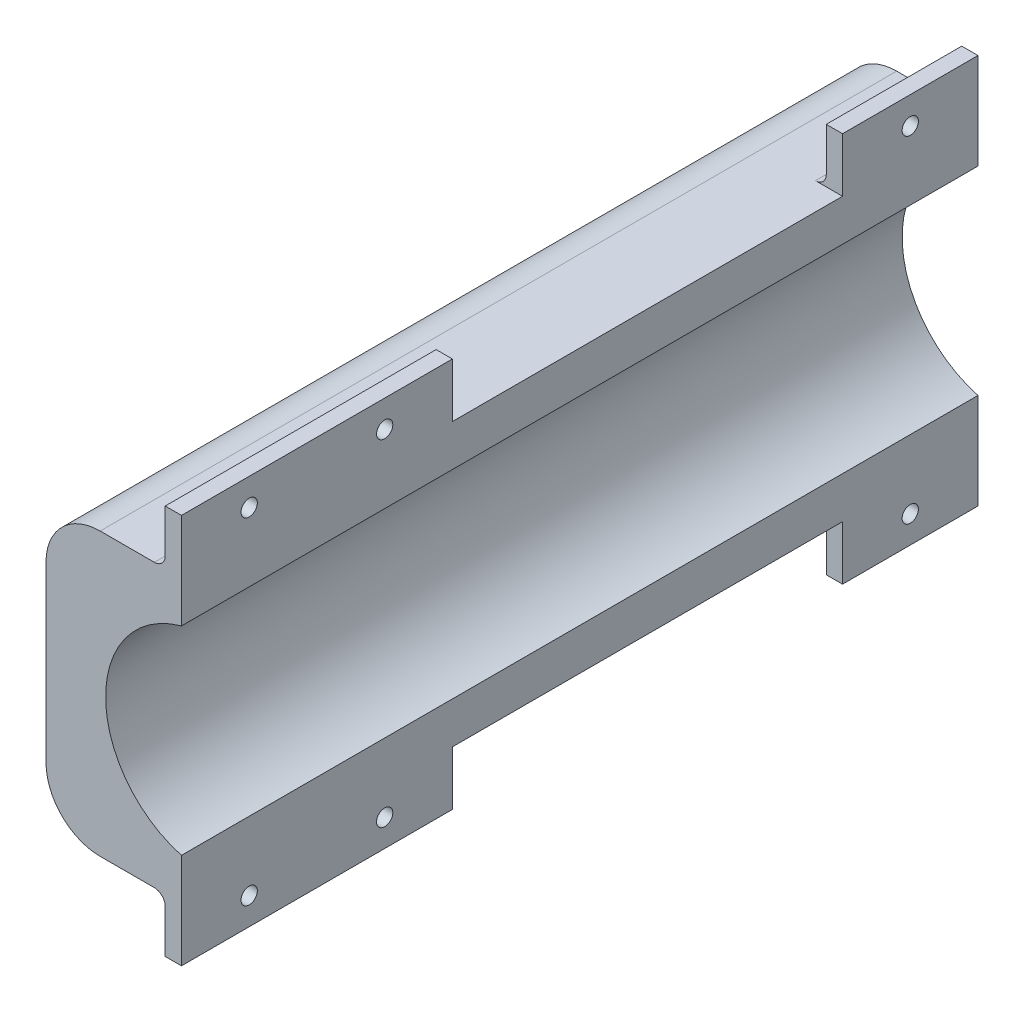
ISO-10303-21;
HEADER;
FILE_DESCRIPTION(('STEP AP214'),'2;1');
FILE_NAME('part.step','',(''),(''),'','','');
FILE_SCHEMA(('AUTOMOTIVE_DESIGN { 1 0 10303 214 1 1 1 1 }'));
ENDSEC;
DATA;
#1=APPLICATION_CONTEXT('core data for automotive mechanical design processes');
#2=APPLICATION_PROTOCOL_DEFINITION('international standard','automotive_design',2000,#1);
#3=PRODUCT_CONTEXT('',#1,'mechanical');
#4=PRODUCT('Part','Part','',(#3));
#5=PRODUCT_RELATED_PRODUCT_CATEGORY('part','',(#4));
#6=PRODUCT_DEFINITION_FORMATION('','',#4);
#7=PRODUCT_DEFINITION_CONTEXT('part definition',#1,'design');
#8=PRODUCT_DEFINITION('design','',#6,#7);
#9=PRODUCT_DEFINITION_SHAPE('','',#8);
#10=(LENGTH_UNIT() NAMED_UNIT(*) SI_UNIT(.MILLI.,.METRE.));
#11=(NAMED_UNIT(*) PLANE_ANGLE_UNIT() SI_UNIT($,.RADIAN.));
#12=(NAMED_UNIT(*) SI_UNIT($,.STERADIAN.) SOLID_ANGLE_UNIT());
#13=UNCERTAINTY_MEASURE_WITH_UNIT(LENGTH_MEASURE(1.E-05),#10,'distance_accuracy_value','');
#14=(GEOMETRIC_REPRESENTATION_CONTEXT(3) GLOBAL_UNCERTAINTY_ASSIGNED_CONTEXT((#13)) GLOBAL_UNIT_ASSIGNED_CONTEXT((#10,
#11,#12)) REPRESENTATION_CONTEXT('',''));
#15=CARTESIAN_POINT('',(0.,0.,0.));
#16=DIRECTION('',(0.,0.,1.));
#17=DIRECTION('',(1.,0.,0.));
#18=AXIS2_PLACEMENT_3D('',#15,#16,#17);
#19=CARTESIAN_POINT('',(-91.4594919412775,15.9586901512976,-147.));
#20=DIRECTION('',(0.,1.,0.));
#21=DIRECTION('',(-1.,0.,0.));
#22=AXIS2_PLACEMENT_3D('',#19,#20,#21);
#23=PLANE('',#22);
#24=DIRECTION('',(1.,0.,0.));
#25=VECTOR('',#24,1.);
#26=CARTESIAN_POINT('',(-94.4594919412775,15.9586901512976,-122.));
#27=LINE('',#26,#25);
#28=CARTESIAN_POINT('',(-96.4594919412775,15.9586901512976,-122.));
#29=VERTEX_POINT('',#28);
#30=CARTESIAN_POINT('',(-91.4594919412775,15.9586901512976,-122.));
#31=VERTEX_POINT('',#30);
#32=EDGE_CURVE('E295',#29,#31,#27,.T.);
#33=ORIENTED_EDGE('',*,*,#32,.F.);
#34=DIRECTION('',(0.,0.,-1.));
#35=VECTOR('',#34,1.);
#36=CARTESIAN_POINT('',(-96.4594919412775,15.9586901512976,-147.));
#37=LINE('',#36,#35);
#38=CARTESIAN_POINT('',(-96.4594919412775,15.9586901512976,-147.));
#39=VERTEX_POINT('',#38);
#40=EDGE_CURVE('E404',#29,#39,#37,.T.);
#41=ORIENTED_EDGE('',*,*,#40,.T.);
#42=DIRECTION('',(-1.,0.,0.));
#43=VECTOR('',#42,1.);
#44=CARTESIAN_POINT('',(-91.4594919412775,15.9586901512976,-147.));
#45=LINE('',#44,#43);
#46=CARTESIAN_POINT('',(-106.459491941278,15.9586901512976,-147.));
#47=VERTEX_POINT('',#46);
#48=EDGE_CURVE('E349',#39,#47,#45,.T.);
#49=ORIENTED_EDGE('',*,*,#48,.T.);
#50=DIRECTION('',(0.,0.,1.));
#51=VECTOR('',#50,1.);
#52=CARTESIAN_POINT('',(-106.459491941278,15.9586901512976,-147.));
#53=LINE('',#52,#51);
#54=CARTESIAN_POINT('',(-106.459491941278,15.9586901512976,0.));
#55=VERTEX_POINT('',#54);
#56=EDGE_CURVE('E368',#47,#55,#53,.T.);
#57=ORIENTED_EDGE('',*,*,#56,.T.);
#58=DIRECTION('',(-1.,0.,0.));
#59=VECTOR('',#58,1.);
#60=CARTESIAN_POINT('',(-91.4594919412775,15.9586901512976,0.));
#61=LINE('',#60,#59);
#62=CARTESIAN_POINT('',(-96.4594919412775,15.9586901512976,0.));
#63=VERTEX_POINT('',#62);
#64=EDGE_CURVE('E340',#63,#55,#61,.T.);
#65=ORIENTED_EDGE('',*,*,#64,.F.);
#66=DIRECTION('',(0.,0.,-1.));
#67=VECTOR('',#66,1.);
#68=CARTESIAN_POINT('',(-96.4594919412775,15.9586901512976,-50.));
#69=LINE('',#68,#67);
#70=CARTESIAN_POINT('',(-96.4594919412775,15.9586901512976,-50.));
#71=VERTEX_POINT('',#70);
#72=EDGE_CURVE('E401',#63,#71,#69,.T.);
#73=ORIENTED_EDGE('',*,*,#72,.T.);
#74=DIRECTION('',(1.,0.,0.));
#75=VECTOR('',#74,1.);
#76=CARTESIAN_POINT('',(-94.4594919412775,15.9586901512976,-50.));
#77=LINE('',#76,#75);
#78=CARTESIAN_POINT('',(-91.4594919412775,15.9586901512976,-50.));
#79=VERTEX_POINT('',#78);
#80=EDGE_CURVE('E323',#71,#79,#77,.T.);
#81=ORIENTED_EDGE('',*,*,#80,.T.);
#82=DIRECTION('',(0.,0.,1.));
#83=VECTOR('',#82,1.);
#84=CARTESIAN_POINT('',(-91.4594919412775,15.9586901512976,-147.));
#85=LINE('',#84,#83);
#86=EDGE_CURVE('E366',#31,#79,#85,.T.);
#87=ORIENTED_EDGE('',*,*,#86,.F.);
#88=EDGE_LOOP('',(#33,#41,#49,#57,#65,#73,#81,#87));
#89=FACE_BOUND('',#88,.T.);
#90=ADVANCED_FACE('F39',(#89),#23,.T.);
#91=CARTESIAN_POINT('',(-116.459491941278,-36.0413098487024,-147.));
#92=DIRECTION('',(-1.,0.,0.));
#93=DIRECTION('',(0.,0.,1.));
#94=AXIS2_PLACEMENT_3D('',#91,#92,#93);
#95=PLANE('',#94);
#96=DIRECTION('',(0.,-1.,0.));
#97=VECTOR('',#96,1.);
#98=CARTESIAN_POINT('',(-116.459491941278,-36.0413098487024,0.));
#99=LINE('',#98,#97);
#100=CARTESIAN_POINT('',(-116.459491941278,5.95869015129755,0.));
#101=VERTEX_POINT('',#100);
#102=CARTESIAN_POINT('',(-116.459491941278,-26.0413098487024,0.));
#103=VERTEX_POINT('',#102);
#104=EDGE_CURVE('E331',#101,#103,#99,.T.);
#105=ORIENTED_EDGE('',*,*,#104,.F.);
#106=DIRECTION('',(0.,0.,1.));
#107=VECTOR('',#106,1.);
#108=CARTESIAN_POINT('',(-116.459491941278,5.95869015129756,-147.));
#109=LINE('',#108,#107);
#110=CARTESIAN_POINT('',(-116.459491941278,5.95869015129755,-147.));
#111=VERTEX_POINT('',#110);
#112=EDGE_CURVE('E383',#101,#111,#109,.F.);
#113=ORIENTED_EDGE('',*,*,#112,.T.);
#114=DIRECTION('',(0.,-1.,0.));
#115=VECTOR('',#114,1.);
#116=CARTESIAN_POINT('',(-116.459491941278,-36.0413098487024,-147.));
#117=LINE('',#116,#115);
#118=CARTESIAN_POINT('',(-116.459491941278,-26.0413098487024,-147.));
#119=VERTEX_POINT('',#118);
#120=EDGE_CURVE('E336',#111,#119,#117,.T.);
#121=ORIENTED_EDGE('',*,*,#120,.T.);
#122=DIRECTION('',(0.,0.,1.));
#123=VECTOR('',#122,1.);
#124=CARTESIAN_POINT('',(-116.459491941278,-26.0413098487024,-147.));
#125=LINE('',#124,#123);
#126=EDGE_CURVE('E380',#119,#103,#125,.T.);
#127=ORIENTED_EDGE('',*,*,#126,.T.);
#128=EDGE_LOOP('',(#105,#113,#121,#127));
#129=FACE_BOUND('',#128,.T.);
#130=ADVANCED_FACE('F492',(#129),#95,.T.);
#131=CARTESIAN_POINT('',(-91.4594919412775,15.9586901512976,-147.));
#132=DIRECTION('',(1.,0.,0.));
#133=DIRECTION('',(0.,0.,-1.));
#134=AXIS2_PLACEMENT_3D('',#131,#132,#133);
#135=PLANE('',#134);
#136=DIRECTION('',(0.,1.,0.));
#137=VECTOR('',#136,1.);
#138=CARTESIAN_POINT('',(-91.4594919412775,15.9586901512976,0.));
#139=LINE('',#138,#137);
#140=CARTESIAN_POINT('',(-91.4594919412775,8.28899293112093,0.));
#141=VERTEX_POINT('',#140);
#142=CARTESIAN_POINT('',(-91.4594919412775,25.9586901512976,0.));
#143=VERTEX_POINT('',#142);
#144=EDGE_CURVE('E363',#141,#143,#139,.T.);
#145=ORIENTED_EDGE('',*,*,#144,.F.);
#146=DIRECTION('',(0.,0.,1.));
#147=VECTOR('',#146,1.);
#148=CARTESIAN_POINT('',(-91.4594919412775,8.28899293112093,-147.));
#149=LINE('',#148,#147);
#150=CARTESIAN_POINT('',(-91.4594919412775,8.28899293112093,-147.));
#151=VERTEX_POINT('',#150);
#152=EDGE_CURVE('E369',#151,#141,#149,.T.);
#153=ORIENTED_EDGE('',*,*,#152,.F.);
#154=DIRECTION('',(0.,1.,0.));
#155=VECTOR('',#154,1.);
#156=CARTESIAN_POINT('',(-91.4594919412775,15.9586901512976,-147.));
#157=LINE('',#156,#155);
#158=CARTESIAN_POINT('',(-91.4594919412775,25.9586901512976,-147.));
#159=VERTEX_POINT('',#158);
#160=EDGE_CURVE('E347',#151,#159,#157,.T.);
#161=ORIENTED_EDGE('',*,*,#160,.T.);
#162=DIRECTION('',(0.,0.,1.));
#163=VECTOR('',#162,1.);
#164=CARTESIAN_POINT('',(-91.4594919412775,25.9586901512976,-122.));
#165=LINE('',#164,#163);
#166=CARTESIAN_POINT('',(-91.4594919412775,25.9586901512976,-122.));
#167=VERTEX_POINT('',#166);
#168=EDGE_CURVE('E278',#159,#167,#165,.T.);
#169=ORIENTED_EDGE('',*,*,#168,.T.);
#170=DIRECTION('',(0.,-1.,0.));
#171=VECTOR('',#170,1.);
#172=CARTESIAN_POINT('',(-91.4594919412775,15.9586901512976,-122.));
#173=LINE('',#172,#171);
#174=EDGE_CURVE('E284',#167,#31,#173,.T.);
#175=ORIENTED_EDGE('',*,*,#174,.T.);
#176=ORIENTED_EDGE('',*,*,#86,.T.);
#177=DIRECTION('',(0.,1.,0.));
#178=VECTOR('',#177,1.);
#179=CARTESIAN_POINT('',(-91.4594919412775,25.9586901512976,-50.));
#180=LINE('',#179,#178);
#181=CARTESIAN_POINT('',(-91.4594919412775,25.9586901512976,-50.));
#182=VERTEX_POINT('',#181);
#183=EDGE_CURVE('E312',#79,#182,#180,.T.);
#184=ORIENTED_EDGE('',*,*,#183,.T.);
#185=DIRECTION('',(0.,0.,1.));
#186=VECTOR('',#185,1.);
#187=CARTESIAN_POINT('',(-91.4594919412775,25.9586901512976,0.));
#188=LINE('',#187,#186);
#189=EDGE_CURVE('E318',#182,#143,#188,.T.);
#190=ORIENTED_EDGE('',*,*,#189,.T.);
#191=EDGE_LOOP('',(#145,#153,#161,#169,#175,#176,#184,#190));
#192=FACE_BOUND('',#191,.T.);
#193=CARTESIAN_POINT('',(-91.4594919412775,20.9586901512976,-37.5));
#194=DIRECTION('',(1.,0.,0.));
#195=DIRECTION('',(0.,0.,1.));
#196=AXIS2_PLACEMENT_3D('',#193,#194,#195);
#197=CIRCLE('',#196,1.5);
#198=CARTESIAN_POINT('',(-91.4594919412775,20.9586901512976,-36.));
#199=VERTEX_POINT('',#198);
#200=EDGE_CURVE('E298',#199,#199,#197,.T.);
#201=ORIENTED_EDGE('',*,*,#200,.F.);
#202=EDGE_LOOP('',(#201));
#203=FACE_BOUND('',#202,.T.);
#204=CARTESIAN_POINT('',(-91.4594919412775,20.9586901512976,-12.5));
#205=DIRECTION('',(1.,0.,0.));
#206=DIRECTION('',(0.,0.,-1.));
#207=AXIS2_PLACEMENT_3D('',#204,#205,#206);
#208=CIRCLE('',#207,1.5);
#209=CARTESIAN_POINT('',(-91.4594919412775,20.9586901512976,-14.));
#210=VERTEX_POINT('',#209);
#211=EDGE_CURVE('E306',#210,#210,#208,.T.);
#212=ORIENTED_EDGE('',*,*,#211,.F.);
#213=EDGE_LOOP('',(#212));
#214=FACE_BOUND('',#213,.T.);
#215=CARTESIAN_POINT('',(-91.4594919412775,20.9586901512976,-134.5));
#216=DIRECTION('',(1.,0.,0.));
#217=DIRECTION('',(0.,0.,-1.));
#218=AXIS2_PLACEMENT_3D('',#215,#216,#217);
#219=CIRCLE('',#218,1.5);
#220=CARTESIAN_POINT('',(-91.4594919412775,20.9586901512976,-136.));
#221=VERTEX_POINT('',#220);
#222=EDGE_CURVE('E270',#221,#221,#219,.T.);
#223=ORIENTED_EDGE('',*,*,#222,.F.);
#224=EDGE_LOOP('',(#223));
#225=FACE_BOUND('',#224,.T.);
#226=ADVANCED_FACE('F457',(#192,#203,#214,#225),#135,.T.);
#227=CARTESIAN_POINT('',(-86.4594919412775,-10.0413098487024,-147.));
#228=DIRECTION('',(0.,0.,1.));
#229=DIRECTION('',(1.,0.,0.));
#230=AXIS2_PLACEMENT_3D('',#227,#228,#229);
#231=CYLINDRICAL_SURFACE('',#230,19.);
#232=CARTESIAN_POINT('',(-86.4594919412775,-10.0413098487024,0.));
#233=DIRECTION('',(0.,0.,-1.));
#234=DIRECTION('',(1.,0.,0.));
#235=AXIS2_PLACEMENT_3D('',#232,#233,#234);
#236=CIRCLE('',#235,19.);
#237=CARTESIAN_POINT('',(-91.4594919412775,-28.3716126285258,0.));
#238=VERTEX_POINT('',#237);
#239=EDGE_CURVE('E360',#238,#141,#236,.T.);
#240=ORIENTED_EDGE('',*,*,#239,.F.);
#241=DIRECTION('',(0.,0.,1.));
#242=VECTOR('',#241,1.);
#243=CARTESIAN_POINT('',(-91.4594919412775,-28.3716126285258,-147.));
#244=LINE('',#243,#242);
#245=CARTESIAN_POINT('',(-91.4594919412775,-28.3716126285258,-147.));
#246=VERTEX_POINT('',#245);
#247=EDGE_CURVE('E371',#246,#238,#244,.T.);
#248=ORIENTED_EDGE('',*,*,#247,.F.);
#249=CARTESIAN_POINT('',(-86.4594919412775,-10.0413098487024,-147.));
#250=DIRECTION('',(0.,0.,-1.));
#251=DIRECTION('',(1.,0.,0.));
#252=AXIS2_PLACEMENT_3D('',#249,#250,#251);
#253=CIRCLE('',#252,19.);
#254=EDGE_CURVE('E344',#246,#151,#253,.T.);
#255=ORIENTED_EDGE('',*,*,#254,.T.);
#256=ORIENTED_EDGE('',*,*,#152,.T.);
#257=EDGE_LOOP('',(#240,#248,#255,#256));
#258=FACE_BOUND('',#257,.T.);
#259=ADVANCED_FACE('F469',(#258),#231,.F.);
#260=CARTESIAN_POINT('',(-91.4594919412775,-28.3716126285258,-147.));
#261=DIRECTION('',(1.,0.,0.));
#262=DIRECTION('',(0.,0.,-1.));
#263=AXIS2_PLACEMENT_3D('',#260,#261,#262);
#264=PLANE('',#263);
#265=DIRECTION('',(0.,1.,0.));
#266=VECTOR('',#265,1.);
#267=CARTESIAN_POINT('',(-91.4594919412775,-28.3716126285258,0.));
#268=LINE('',#267,#266);
#269=CARTESIAN_POINT('',(-91.4594919412775,-46.0413098487024,0.));
#270=VERTEX_POINT('',#269);
#271=EDGE_CURVE('E357',#270,#238,#268,.T.);
#272=ORIENTED_EDGE('',*,*,#271,.F.);
#273=DIRECTION('',(0.,0.,-1.));
#274=VECTOR('',#273,1.);
#275=CARTESIAN_POINT('',(-91.4594919412775,-46.0413098487024,0.));
#276=LINE('',#275,#274);
#277=CARTESIAN_POINT('',(-91.4594919412775,-46.0413098487024,-50.));
#278=VERTEX_POINT('',#277);
#279=EDGE_CURVE('E250',#270,#278,#276,.T.);
#280=ORIENTED_EDGE('',*,*,#279,.T.);
#281=DIRECTION('',(0.,1.,0.));
#282=VECTOR('',#281,1.);
#283=CARTESIAN_POINT('',(-91.4594919412775,-46.0413098487024,-50.));
#284=LINE('',#283,#282);
#285=CARTESIAN_POINT('',(-91.4594919412775,-36.0413098487024,-50.));
#286=VERTEX_POINT('',#285);
#287=EDGE_CURVE('E256',#278,#286,#284,.T.);
#288=ORIENTED_EDGE('',*,*,#287,.T.);
#289=DIRECTION('',(0.,0.,1.));
#290=VECTOR('',#289,1.);
#291=CARTESIAN_POINT('',(-91.4594919412775,-36.0413098487024,-147.));
#292=LINE('',#291,#290);
#293=CARTESIAN_POINT('',(-91.4594919412775,-36.0413098487024,-122.));
#294=VERTEX_POINT('',#293);
#295=EDGE_CURVE('E351',#294,#286,#292,.T.);
#296=ORIENTED_EDGE('',*,*,#295,.F.);
#297=DIRECTION('',(0.,-1.,0.));
#298=VECTOR('',#297,1.);
#299=CARTESIAN_POINT('',(-91.4594919412775,-36.0413098487024,-122.));
#300=LINE('',#299,#298);
#301=CARTESIAN_POINT('',(-91.4594919412775,-46.0413098487024,-122.));
#302=VERTEX_POINT('',#301);
#303=EDGE_CURVE('E226',#294,#302,#300,.T.);
#304=ORIENTED_EDGE('',*,*,#303,.T.);
#305=DIRECTION('',(0.,0.,-1.));
#306=VECTOR('',#305,1.);
#307=CARTESIAN_POINT('',(-91.4594919412775,-46.0413098487024,-122.));
#308=LINE('',#307,#306);
#309=CARTESIAN_POINT('',(-91.4594919412775,-46.0413098487024,-147.));
#310=VERTEX_POINT('',#309);
#311=EDGE_CURVE('E229',#302,#310,#308,.T.);
#312=ORIENTED_EDGE('',*,*,#311,.T.);
#313=DIRECTION('',(0.,1.,0.));
#314=VECTOR('',#313,1.);
#315=CARTESIAN_POINT('',(-91.4594919412775,-28.3716126285258,-147.));
#316=LINE('',#315,#314);
#317=EDGE_CURVE('E207',#310,#246,#316,.T.);
#318=ORIENTED_EDGE('',*,*,#317,.T.);
#319=ORIENTED_EDGE('',*,*,#247,.T.);
#320=EDGE_LOOP('',(#272,#280,#288,#296,#304,#312,#318,#319));
#321=FACE_BOUND('',#320,.T.);
#322=CARTESIAN_POINT('',(-91.4594919412775,-41.0413098487024,-12.5));
#323=DIRECTION('',(1.,0.,0.));
#324=DIRECTION('',(0.,0.,1.));
#325=AXIS2_PLACEMENT_3D('',#322,#323,#324);
#326=CIRCLE('',#325,1.5);
#327=CARTESIAN_POINT('',(-91.4594919412775,-41.0413098487024,-11.));
#328=VERTEX_POINT('',#327);
#329=EDGE_CURVE('E239',#328,#328,#326,.T.);
#330=ORIENTED_EDGE('',*,*,#329,.F.);
#331=EDGE_LOOP('',(#330));
#332=FACE_BOUND('',#331,.T.);
#333=CARTESIAN_POINT('',(-91.4594919412775,-41.0413098487024,-37.5));
#334=DIRECTION('',(1.,0.,0.));
#335=DIRECTION('',(0.,0.,-1.));
#336=AXIS2_PLACEMENT_3D('',#333,#334,#335);
#337=CIRCLE('',#336,1.5);
#338=CARTESIAN_POINT('',(-91.4594919412775,-41.0413098487024,-39.));
#339=VERTEX_POINT('',#338);
#340=EDGE_CURVE('E244',#339,#339,#337,.T.);
#341=ORIENTED_EDGE('',*,*,#340,.F.);
#342=EDGE_LOOP('',(#341));
#343=FACE_BOUND('',#342,.T.);
#344=CARTESIAN_POINT('',(-91.4594919412775,-41.0413098487024,-134.5));
#345=DIRECTION('',(1.,0.,0.));
#346=DIRECTION('',(0.,0.,1.));
#347=AXIS2_PLACEMENT_3D('',#344,#345,#346);
#348=CIRCLE('',#347,1.5);
#349=CARTESIAN_POINT('',(-91.4594919412775,-41.0413098487024,-133.));
#350=VERTEX_POINT('',#349);
#351=EDGE_CURVE('E232',#350,#350,#348,.T.);
#352=ORIENTED_EDGE('',*,*,#351,.F.);
#353=EDGE_LOOP('',(#352));
#354=FACE_BOUND('',#353,.T.);
#355=ADVANCED_FACE('F471',(#321,#332,#343,#354),#264,.T.);
#356=CARTESIAN_POINT('',(-91.4594919412775,-36.0413098487024,-147.));
#357=DIRECTION('',(0.,-1.,0.));
#358=DIRECTION('',(0.,0.,-1.));
#359=AXIS2_PLACEMENT_3D('',#356,#357,#358);
#360=PLANE('',#359);
#361=DIRECTION('',(1.,0.,0.));
#362=VECTOR('',#361,1.);
#363=CARTESIAN_POINT('',(-94.4594919412775,-36.0413098487024,-50.));
#364=LINE('',#363,#362);
#365=CARTESIAN_POINT('',(-96.4594919412775,-36.0413098487024,-50.));
#366=VERTEX_POINT('',#365);
#367=EDGE_CURVE('E267',#366,#286,#364,.T.);
#368=ORIENTED_EDGE('',*,*,#367,.F.);
#369=DIRECTION('',(0.,0.,1.));
#370=VECTOR('',#369,1.);
#371=CARTESIAN_POINT('',(-96.4594919412775,-36.0413098487024,-147.));
#372=LINE('',#371,#370);
#373=CARTESIAN_POINT('',(-96.4594919412775,-36.0413098487024,0.));
#374=VERTEX_POINT('',#373);
#375=EDGE_CURVE('E395',#366,#374,#372,.T.);
#376=ORIENTED_EDGE('',*,*,#375,.T.);
#377=DIRECTION('',(1.,0.,0.));
#378=VECTOR('',#377,1.);
#379=CARTESIAN_POINT('',(-91.4594919412775,-36.0413098487024,0.));
#380=LINE('',#379,#378);
#381=CARTESIAN_POINT('',(-106.459491941278,-36.0413098487024,0.));
#382=VERTEX_POINT('',#381);
#383=EDGE_CURVE('E354',#382,#374,#380,.T.);
#384=ORIENTED_EDGE('',*,*,#383,.F.);
#385=DIRECTION('',(0.,0.,1.));
#386=VECTOR('',#385,1.);
#387=CARTESIAN_POINT('',(-106.459491941278,-36.0413098487024,-147.));
#388=LINE('',#387,#386);
#389=CARTESIAN_POINT('',(-106.459491941278,-36.0413098487024,-147.));
#390=VERTEX_POINT('',#389);
#391=EDGE_CURVE('E390',#382,#390,#388,.F.);
#392=ORIENTED_EDGE('',*,*,#391,.T.);
#393=DIRECTION('',(1.,0.,0.));
#394=VECTOR('',#393,1.);
#395=CARTESIAN_POINT('',(-91.4594919412775,-36.0413098487024,-147.));
#396=LINE('',#395,#394);
#397=CARTESIAN_POINT('',(-96.4594919412775,-36.0413098487024,-147.));
#398=VERTEX_POINT('',#397);
#399=EDGE_CURVE('E339',#390,#398,#396,.T.);
#400=ORIENTED_EDGE('',*,*,#399,.T.);
#401=DIRECTION('',(0.,0.,1.));
#402=VECTOR('',#401,1.);
#403=CARTESIAN_POINT('',(-96.4594919412775,-36.0413098487024,-147.));
#404=LINE('',#403,#402);
#405=CARTESIAN_POINT('',(-96.4594919412775,-36.0413098487024,-122.));
#406=VERTEX_POINT('',#405);
#407=EDGE_CURVE('E392',#398,#406,#404,.T.);
#408=ORIENTED_EDGE('',*,*,#407,.T.);
#409=DIRECTION('',(1.,0.,0.));
#410=VECTOR('',#409,1.);
#411=CARTESIAN_POINT('',(-94.4594919412775,-36.0413098487024,-122.));
#412=LINE('',#411,#410);
#413=EDGE_CURVE('E212',#406,#294,#412,.T.);
#414=ORIENTED_EDGE('',*,*,#413,.T.);
#415=ORIENTED_EDGE('',*,*,#295,.T.);
#416=EDGE_LOOP('',(#368,#376,#384,#392,#400,#408,#414,#415));
#417=FACE_BOUND('',#416,.T.);
#418=ADVANCED_FACE('F484',(#417),#360,.T.);
#419=CARTESIAN_POINT('',(-86.4594919412775,-10.0413098487024,-147.));
#420=DIRECTION('',(0.,0.,1.));
#421=DIRECTION('',(1.,0.,0.));
#422=AXIS2_PLACEMENT_3D('',#419,#420,#421);
#423=PLANE('',#422);
#424=ORIENTED_EDGE('',*,*,#120,.F.);
#425=CARTESIAN_POINT('',(-106.459491941278,5.95869015129756,-147.));
#426=DIRECTION('',(0.,0.,1.));
#427=DIRECTION('',(1.,0.,0.));
#428=AXIS2_PLACEMENT_3D('',#425,#426,#427);
#429=CIRCLE('',#428,10.);
#430=EDGE_CURVE('E387',#111,#47,#429,.F.);
#431=ORIENTED_EDGE('',*,*,#430,.T.);
#432=ORIENTED_EDGE('',*,*,#48,.F.);
#433=CARTESIAN_POINT('',(-96.4594919412775,17.9586901512976,-147.));
#434=DIRECTION('',(0.,0.,1.));
#435=DIRECTION('',(1.,0.,0.));
#436=AXIS2_PLACEMENT_3D('',#433,#434,#435);
#437=CIRCLE('',#436,2.);
#438=CARTESIAN_POINT('',(-94.4594919412775,17.9586901512976,-147.));
#439=VERTEX_POINT('',#438);
#440=EDGE_CURVE('E419',#39,#439,#437,.T.);
#441=ORIENTED_EDGE('',*,*,#440,.T.);
#442=DIRECTION('',(0.,1.,0.));
#443=VECTOR('',#442,1.);
#444=CARTESIAN_POINT('',(-94.4594919412775,25.9586901512976,-147.));
#445=LINE('',#444,#443);
#446=CARTESIAN_POINT('',(-94.4594919412775,25.9586901512976,-147.));
#447=VERTEX_POINT('',#446);
#448=EDGE_CURVE('E281',#439,#447,#445,.T.);
#449=ORIENTED_EDGE('',*,*,#448,.T.);
#450=DIRECTION('',(1.,0.,0.));
#451=VECTOR('',#450,1.);
#452=CARTESIAN_POINT('',(-94.4594919412775,25.9586901512976,-147.));
#453=LINE('',#452,#451);
#454=EDGE_CURVE('E290',#447,#159,#453,.T.);
#455=ORIENTED_EDGE('',*,*,#454,.T.);
#456=ORIENTED_EDGE('',*,*,#160,.F.);
#457=ORIENTED_EDGE('',*,*,#254,.F.);
#458=ORIENTED_EDGE('',*,*,#317,.F.);
#459=DIRECTION('',(1.,0.,0.));
#460=VECTOR('',#459,1.);
#461=CARTESIAN_POINT('',(-94.4594919412775,-46.0413098487024,-147.));
#462=LINE('',#461,#460);
#463=CARTESIAN_POINT('',(-94.4594919412775,-46.0413098487024,-147.));
#464=VERTEX_POINT('',#463);
#465=EDGE_CURVE('E199',#464,#310,#462,.T.);
#466=ORIENTED_EDGE('',*,*,#465,.F.);
#467=DIRECTION('',(0.,1.,0.));
#468=VECTOR('',#467,1.);
#469=CARTESIAN_POINT('',(-94.4594919412775,-46.0413098487024,-147.));
#470=LINE('',#469,#468);
#471=CARTESIAN_POINT('',(-94.4594919412775,-38.0413098487024,-147.));
#472=VERTEX_POINT('',#471);
#473=EDGE_CURVE('E203',#464,#472,#470,.T.);
#474=ORIENTED_EDGE('',*,*,#473,.T.);
#475=CARTESIAN_POINT('',(-96.4594919412775,-38.0413098487024,-147.));
#476=DIRECTION('',(0.,0.,1.));
#477=DIRECTION('',(1.,0.,0.));
#478=AXIS2_PLACEMENT_3D('',#475,#476,#477);
#479=CIRCLE('',#478,2.);
#480=EDGE_CURVE('E417',#472,#398,#479,.T.);
#481=ORIENTED_EDGE('',*,*,#480,.T.);
#482=ORIENTED_EDGE('',*,*,#399,.F.);
#483=CARTESIAN_POINT('',(-106.459491941278,-26.0413098487024,-147.));
#484=DIRECTION('',(0.,0.,1.));
#485=DIRECTION('',(1.,0.,0.));
#486=AXIS2_PLACEMENT_3D('',#483,#484,#485);
#487=CIRCLE('',#486,10.);
#488=EDGE_CURVE('E385',#390,#119,#487,.F.);
#489=ORIENTED_EDGE('',*,*,#488,.T.);
#490=EDGE_LOOP('',(#424,#431,#432,#441,#449,#455,#456,#457,#458,#466,#474,#481,#482,#489));
#491=FACE_BOUND('',#490,.T.);
#492=ADVANCED_FACE('F202',(#491),#423,.F.);
#493=CARTESIAN_POINT('',(-86.4594919412775,-10.0413098487024,0.));
#494=DIRECTION('',(0.,0.,1.));
#495=DIRECTION('',(1.,0.,0.));
#496=AXIS2_PLACEMENT_3D('',#493,#494,#495);
#497=PLANE('',#496);
#498=DIRECTION('',(0.,-1.,0.));
#499=VECTOR('',#498,1.);
#500=CARTESIAN_POINT('',(-94.4594919412775,15.9586901512976,0.));
#501=LINE('',#500,#499);
#502=CARTESIAN_POINT('',(-94.4594919412775,25.9586901512976,0.));
#503=VERTEX_POINT('',#502);
#504=CARTESIAN_POINT('',(-94.4594919412775,17.9586901512976,0.));
#505=VERTEX_POINT('',#504);
#506=EDGE_CURVE('E315',#503,#505,#501,.T.);
#507=ORIENTED_EDGE('',*,*,#506,.T.);
#508=CARTESIAN_POINT('',(-96.4594919412775,17.9586901512976,0.));
#509=DIRECTION('',(0.,0.,1.));
#510=DIRECTION('',(1.,0.,0.));
#511=AXIS2_PLACEMENT_3D('',#508,#509,#510);
#512=CIRCLE('',#511,2.);
#513=EDGE_CURVE('E11',#505,#63,#512,.F.);
#514=ORIENTED_EDGE('',*,*,#513,.T.);
#515=ORIENTED_EDGE('',*,*,#64,.T.);
#516=CARTESIAN_POINT('',(-106.459491941278,5.95869015129756,0.));
#517=DIRECTION('',(0.,0.,1.));
#518=DIRECTION('',(1.,0.,0.));
#519=AXIS2_PLACEMENT_3D('',#516,#517,#518);
#520=CIRCLE('',#519,10.);
#521=EDGE_CURVE('E378',#55,#101,#520,.T.);
#522=ORIENTED_EDGE('',*,*,#521,.T.);
#523=ORIENTED_EDGE('',*,*,#104,.T.);
#524=CARTESIAN_POINT('',(-106.459491941278,-26.0413098487024,0.));
#525=DIRECTION('',(0.,0.,1.));
#526=DIRECTION('',(1.,0.,0.));
#527=AXIS2_PLACEMENT_3D('',#524,#525,#526);
#528=CIRCLE('',#527,10.);
#529=EDGE_CURVE('E376',#103,#382,#528,.T.);
#530=ORIENTED_EDGE('',*,*,#529,.T.);
#531=ORIENTED_EDGE('',*,*,#383,.T.);
#532=CARTESIAN_POINT('',(-96.4594919412775,-38.0413098487024,0.));
#533=DIRECTION('',(0.,0.,1.));
#534=DIRECTION('',(1.,0.,0.));
#535=AXIS2_PLACEMENT_3D('',#532,#533,#534);
#536=CIRCLE('',#535,2.);
#537=CARTESIAN_POINT('',(-94.4594919412775,-38.0413098487024,0.));
#538=VERTEX_POINT('',#537);
#539=EDGE_CURVE('E410',#374,#538,#536,.F.);
#540=ORIENTED_EDGE('',*,*,#539,.T.);
#541=DIRECTION('',(0.,-1.,0.));
#542=VECTOR('',#541,1.);
#543=CARTESIAN_POINT('',(-94.4594919412775,-36.0413098487024,0.));
#544=LINE('',#543,#542);
#545=CARTESIAN_POINT('',(-94.4594919412775,-46.0413098487024,0.));
#546=VERTEX_POINT('',#545);
#547=EDGE_CURVE('E253',#538,#546,#544,.T.);
#548=ORIENTED_EDGE('',*,*,#547,.T.);
#549=DIRECTION('',(1.,0.,0.));
#550=VECTOR('',#549,1.);
#551=CARTESIAN_POINT('',(-94.4594919412775,-46.0413098487024,0.));
#552=LINE('',#551,#550);
#553=EDGE_CURVE('E262',#546,#270,#552,.T.);
#554=ORIENTED_EDGE('',*,*,#553,.T.);
#555=ORIENTED_EDGE('',*,*,#271,.T.);
#556=ORIENTED_EDGE('',*,*,#239,.T.);
#557=ORIENTED_EDGE('',*,*,#144,.T.);
#558=DIRECTION('',(1.,0.,0.));
#559=VECTOR('',#558,1.);
#560=CARTESIAN_POINT('',(-94.4594919412775,25.9586901512976,0.));
#561=LINE('',#560,#559);
#562=EDGE_CURVE('E328',#503,#143,#561,.T.);
#563=ORIENTED_EDGE('',*,*,#562,.F.);
#564=EDGE_LOOP('',(#507,#514,#515,#522,#523,#530,#531,#540,#548,#554,#555,#556,#557,#563));
#565=FACE_BOUND('',#564,.T.);
#566=ADVANCED_FACE('F446',(#565),#497,.T.);
#567=CARTESIAN_POINT('',(-94.4594919412775,25.9586901512976,0.));
#568=DIRECTION('',(0.,1.,0.));
#569=DIRECTION('',(0.,0.,1.));
#570=AXIS2_PLACEMENT_3D('',#567,#568,#569);
#571=PLANE('',#570);
#572=ORIENTED_EDGE('',*,*,#189,.F.);
#573=DIRECTION('',(1.,0.,0.));
#574=VECTOR('',#573,1.);
#575=CARTESIAN_POINT('',(-94.4594919412775,25.9586901512976,-50.));
#576=LINE('',#575,#574);
#577=CARTESIAN_POINT('',(-94.4594919412775,25.9586901512976,-50.));
#578=VERTEX_POINT('',#577);
#579=EDGE_CURVE('E332',#578,#182,#576,.T.);
#580=ORIENTED_EDGE('',*,*,#579,.F.);
#581=DIRECTION('',(0.,0.,1.));
#582=VECTOR('',#581,1.);
#583=CARTESIAN_POINT('',(-94.4594919412775,25.9586901512976,0.));
#584=LINE('',#583,#582);
#585=EDGE_CURVE('E320',#578,#503,#584,.T.);
#586=ORIENTED_EDGE('',*,*,#585,.T.);
#587=ORIENTED_EDGE('',*,*,#562,.T.);
#588=EDGE_LOOP('',(#572,#580,#586,#587));
#589=FACE_BOUND('',#588,.T.);
#590=ADVANCED_FACE('F452',(#589),#571,.T.);
#591=CARTESIAN_POINT('',(-94.4594919412775,25.9586901512976,-50.));
#592=DIRECTION('',(0.,0.,-1.));
#593=DIRECTION('',(-1.,0.,0.));
#594=AXIS2_PLACEMENT_3D('',#591,#592,#593);
#595=PLANE('',#594);
#596=ORIENTED_EDGE('',*,*,#183,.F.);
#597=ORIENTED_EDGE('',*,*,#80,.F.);
#598=CARTESIAN_POINT('',(-96.4594919412775,17.9586901512976,-50.));
#599=DIRECTION('',(0.,0.,-1.));
#600=DIRECTION('',(-1.,0.,0.));
#601=AXIS2_PLACEMENT_3D('',#598,#599,#600);
#602=CIRCLE('',#601,2.);
#603=CARTESIAN_POINT('',(-94.4594919412775,17.9586901512976,-50.));
#604=VERTEX_POINT('',#603);
#605=EDGE_CURVE('E47',#71,#604,#602,.F.);
#606=ORIENTED_EDGE('',*,*,#605,.T.);
#607=DIRECTION('',(0.,1.,0.));
#608=VECTOR('',#607,1.);
#609=CARTESIAN_POINT('',(-94.4594919412775,25.9586901512976,-50.));
#610=LINE('',#609,#608);
#611=EDGE_CURVE('E317',#604,#578,#610,.T.);
#612=ORIENTED_EDGE('',*,*,#611,.T.);
#613=ORIENTED_EDGE('',*,*,#579,.T.);
#614=EDGE_LOOP('',(#596,#597,#606,#612,#613));
#615=FACE_BOUND('',#614,.T.);
#616=ADVANCED_FACE('F454',(#615),#595,.T.);
#617=CARTESIAN_POINT('',(-94.4594919412775,0.,0.));
#618=DIRECTION('',(-1.,0.,0.));
#619=DIRECTION('',(0.,0.,1.));
#620=AXIS2_PLACEMENT_3D('',#617,#618,#619);
#621=PLANE('',#620);
#622=CARTESIAN_POINT('',(-94.4594919412775,20.9586901512976,-37.5));
#623=DIRECTION('',(1.,0.,0.));
#624=DIRECTION('',(0.,0.,1.));
#625=AXIS2_PLACEMENT_3D('',#622,#623,#624);
#626=CIRCLE('',#625,1.5);
#627=CARTESIAN_POINT('',(-94.4594919412775,20.9586901512976,-36.));
#628=VERTEX_POINT('',#627);
#629=EDGE_CURVE('E303',#628,#628,#626,.T.);
#630=ORIENTED_EDGE('',*,*,#629,.T.);
#631=EDGE_LOOP('',(#630));
#632=FACE_BOUND('',#631,.T.);
#633=CARTESIAN_POINT('',(-94.4594919412775,20.9586901512976,-12.5));
#634=DIRECTION('',(1.,0.,0.));
#635=DIRECTION('',(0.,0.,-1.));
#636=AXIS2_PLACEMENT_3D('',#633,#634,#635);
#637=CIRCLE('',#636,1.5);
#638=CARTESIAN_POINT('',(-94.4594919412775,20.9586901512976,-14.));
#639=VERTEX_POINT('',#638);
#640=EDGE_CURVE('E309',#639,#639,#637,.T.);
#641=ORIENTED_EDGE('',*,*,#640,.T.);
#642=EDGE_LOOP('',(#641));
#643=FACE_BOUND('',#642,.T.);
#644=ORIENTED_EDGE('',*,*,#611,.F.);
#645=DIRECTION('',(0.,0.,-1.));
#646=VECTOR('',#645,1.);
#647=CARTESIAN_POINT('',(-94.4594919412775,17.9586901512976,0.));
#648=LINE('',#647,#646);
#649=EDGE_CURVE('E60',#604,#505,#648,.F.);
#650=ORIENTED_EDGE('',*,*,#649,.T.);
#651=ORIENTED_EDGE('',*,*,#506,.F.);
#652=ORIENTED_EDGE('',*,*,#585,.F.);
#653=EDGE_LOOP('',(#644,#650,#651,#652));
#654=FACE_BOUND('',#653,.T.);
#655=ADVANCED_FACE('F448',(#632,#643,#654),#621,.T.);
#656=CARTESIAN_POINT('',(-94.4594919412775,20.9586901512976,-12.5));
#657=DIRECTION('',(1.,0.,0.));
#658=DIRECTION('',(0.,0.,-1.));
#659=AXIS2_PLACEMENT_3D('',#656,#657,#658);
#660=CYLINDRICAL_SURFACE('',#659,1.5);
#661=ORIENTED_EDGE('',*,*,#640,.F.);
#662=EDGE_LOOP('',(#661));
#663=FACE_BOUND('',#662,.T.);
#664=ORIENTED_EDGE('',*,*,#211,.T.);
#665=EDGE_LOOP('',(#664));
#666=FACE_BOUND('',#665,.T.);
#667=ADVANCED_FACE('F639',(#663,#666),#660,.F.);
#668=CARTESIAN_POINT('',(-94.4594919412775,20.9586901512976,-37.5));
#669=DIRECTION('',(1.,0.,0.));
#670=DIRECTION('',(0.,0.,-1.));
#671=AXIS2_PLACEMENT_3D('',#668,#669,#670);
#672=CYLINDRICAL_SURFACE('',#671,1.5);
#673=ORIENTED_EDGE('',*,*,#629,.F.);
#674=EDGE_LOOP('',(#673));
#675=FACE_BOUND('',#674,.T.);
#676=ORIENTED_EDGE('',*,*,#200,.T.);
#677=EDGE_LOOP('',(#676));
#678=FACE_BOUND('',#677,.T.);
#679=ADVANCED_FACE('F628',(#675,#678),#672,.F.);
#680=CARTESIAN_POINT('',(-94.4594919412775,15.9586901512976,-122.));
#681=DIRECTION('',(0.,0.,1.));
#682=DIRECTION('',(1.,0.,0.));
#683=AXIS2_PLACEMENT_3D('',#680,#681,#682);
#684=PLANE('',#683);
#685=ORIENTED_EDGE('',*,*,#174,.F.);
#686=DIRECTION('',(1.,0.,0.));
#687=VECTOR('',#686,1.);
#688=CARTESIAN_POINT('',(-94.4594919412775,25.9586901512976,-122.));
#689=LINE('',#688,#687);
#690=CARTESIAN_POINT('',(-94.4594919412775,25.9586901512976,-122.));
#691=VERTEX_POINT('',#690);
#692=EDGE_CURVE('E299',#691,#167,#689,.T.);
#693=ORIENTED_EDGE('',*,*,#692,.F.);
#694=DIRECTION('',(0.,-1.,0.));
#695=VECTOR('',#694,1.);
#696=CARTESIAN_POINT('',(-94.4594919412775,15.9586901512976,-122.));
#697=LINE('',#696,#695);
#698=CARTESIAN_POINT('',(-94.4594919412775,17.9586901512976,-122.));
#699=VERTEX_POINT('',#698);
#700=EDGE_CURVE('E287',#691,#699,#697,.T.);
#701=ORIENTED_EDGE('',*,*,#700,.T.);
#702=CARTESIAN_POINT('',(-96.4594919412775,17.9586901512976,-122.));
#703=DIRECTION('',(0.,0.,1.));
#704=DIRECTION('',(1.,0.,0.));
#705=AXIS2_PLACEMENT_3D('',#702,#703,#704);
#706=CIRCLE('',#705,2.);
#707=EDGE_CURVE('E421',#699,#29,#706,.F.);
#708=ORIENTED_EDGE('',*,*,#707,.T.);
#709=ORIENTED_EDGE('',*,*,#32,.T.);
#710=EDGE_LOOP('',(#685,#693,#701,#708,#709));
#711=FACE_BOUND('',#710,.T.);
#712=ADVANCED_FACE('F427',(#711),#684,.T.);
#713=CARTESIAN_POINT('',(-94.4594919412775,25.9586901512976,-122.));
#714=DIRECTION('',(0.,1.,0.));
#715=DIRECTION('',(0.,0.,1.));
#716=AXIS2_PLACEMENT_3D('',#713,#714,#715);
#717=PLANE('',#716);
#718=ORIENTED_EDGE('',*,*,#168,.F.);
#719=ORIENTED_EDGE('',*,*,#454,.F.);
#720=DIRECTION('',(0.,0.,1.));
#721=VECTOR('',#720,1.);
#722=CARTESIAN_POINT('',(-94.4594919412775,25.9586901512976,-122.));
#723=LINE('',#722,#721);
#724=EDGE_CURVE('E283',#447,#691,#723,.T.);
#725=ORIENTED_EDGE('',*,*,#724,.T.);
#726=ORIENTED_EDGE('',*,*,#692,.T.);
#727=EDGE_LOOP('',(#718,#719,#725,#726));
#728=FACE_BOUND('',#727,.T.);
#729=ADVANCED_FACE('F465',(#728),#717,.T.);
#730=CARTESIAN_POINT('',(-94.4594919412775,0.,0.));
#731=DIRECTION('',(-1.,0.,0.));
#732=DIRECTION('',(0.,0.,1.));
#733=AXIS2_PLACEMENT_3D('',#730,#731,#732);
#734=PLANE('',#733);
#735=CARTESIAN_POINT('',(-94.4594919412775,20.9586901512976,-134.5));
#736=DIRECTION('',(1.,0.,0.));
#737=DIRECTION('',(0.,0.,-1.));
#738=AXIS2_PLACEMENT_3D('',#735,#736,#737);
#739=CIRCLE('',#738,1.5);
#740=CARTESIAN_POINT('',(-94.4594919412775,20.9586901512976,-136.));
#741=VERTEX_POINT('',#740);
#742=EDGE_CURVE('E275',#741,#741,#739,.T.);
#743=ORIENTED_EDGE('',*,*,#742,.T.);
#744=EDGE_LOOP('',(#743));
#745=FACE_BOUND('',#744,.T.);
#746=ORIENTED_EDGE('',*,*,#448,.F.);
#747=DIRECTION('',(0.,0.,-1.));
#748=VECTOR('',#747,1.);
#749=CARTESIAN_POINT('',(-94.4594919412775,17.9586901512976,-122.));
#750=LINE('',#749,#748);
#751=EDGE_CURVE('E407',#439,#699,#750,.F.);
#752=ORIENTED_EDGE('',*,*,#751,.T.);
#753=ORIENTED_EDGE('',*,*,#700,.F.);
#754=ORIENTED_EDGE('',*,*,#724,.F.);
#755=EDGE_LOOP('',(#746,#752,#753,#754));
#756=FACE_BOUND('',#755,.T.);
#757=ADVANCED_FACE('F463',(#745,#756),#734,.T.);
#758=CARTESIAN_POINT('',(-94.4594919412775,20.9586901512976,-134.5));
#759=DIRECTION('',(1.,0.,0.));
#760=DIRECTION('',(0.,0.,-1.));
#761=AXIS2_PLACEMENT_3D('',#758,#759,#760);
#762=CYLINDRICAL_SURFACE('',#761,1.5);
#763=ORIENTED_EDGE('',*,*,#742,.F.);
#764=EDGE_LOOP('',(#763));
#765=FACE_BOUND('',#764,.T.);
#766=ORIENTED_EDGE('',*,*,#222,.T.);
#767=EDGE_LOOP('',(#766));
#768=FACE_BOUND('',#767,.T.);
#769=ADVANCED_FACE('F519',(#765,#768),#762,.F.);
#770=CARTESIAN_POINT('',(-94.4594919412775,-46.0413098487024,-50.));
#771=DIRECTION('',(0.,0.,-1.));
#772=DIRECTION('',(-1.,0.,0.));
#773=AXIS2_PLACEMENT_3D('',#770,#771,#772);
#774=PLANE('',#773);
#775=ORIENTED_EDGE('',*,*,#287,.F.);
#776=DIRECTION('',(1.,0.,0.));
#777=VECTOR('',#776,1.);
#778=CARTESIAN_POINT('',(-94.4594919412775,-46.0413098487024,-50.));
#779=LINE('',#778,#777);
#780=CARTESIAN_POINT('',(-94.4594919412775,-46.0413098487024,-50.));
#781=VERTEX_POINT('',#780);
#782=EDGE_CURVE('E271',#781,#278,#779,.T.);
#783=ORIENTED_EDGE('',*,*,#782,.F.);
#784=DIRECTION('',(0.,1.,0.));
#785=VECTOR('',#784,1.);
#786=CARTESIAN_POINT('',(-94.4594919412775,-46.0413098487024,-50.));
#787=LINE('',#786,#785);
#788=CARTESIAN_POINT('',(-94.4594919412775,-38.0413098487024,-50.));
#789=VERTEX_POINT('',#788);
#790=EDGE_CURVE('E259',#781,#789,#787,.T.);
#791=ORIENTED_EDGE('',*,*,#790,.T.);
#792=CARTESIAN_POINT('',(-96.4594919412775,-38.0413098487024,-50.));
#793=DIRECTION('',(0.,0.,-1.));
#794=DIRECTION('',(-1.,0.,0.));
#795=AXIS2_PLACEMENT_3D('',#792,#793,#794);
#796=CIRCLE('',#795,2.);
#797=EDGE_CURVE('E412',#789,#366,#796,.F.);
#798=ORIENTED_EDGE('',*,*,#797,.T.);
#799=ORIENTED_EDGE('',*,*,#367,.T.);
#800=EDGE_LOOP('',(#775,#783,#791,#798,#799));
#801=FACE_BOUND('',#800,.T.);
#802=ADVANCED_FACE('F506',(#801),#774,.T.);
#803=CARTESIAN_POINT('',(-94.4594919412775,-46.0413098487024,0.));
#804=DIRECTION('',(0.,-1.,0.));
#805=DIRECTION('',(0.,0.,-1.));
#806=AXIS2_PLACEMENT_3D('',#803,#804,#805);
#807=PLANE('',#806);
#808=ORIENTED_EDGE('',*,*,#279,.F.);
#809=ORIENTED_EDGE('',*,*,#553,.F.);
#810=DIRECTION('',(0.,0.,-1.));
#811=VECTOR('',#810,1.);
#812=CARTESIAN_POINT('',(-94.4594919412775,-46.0413098487024,0.));
#813=LINE('',#812,#811);
#814=EDGE_CURVE('E255',#546,#781,#813,.T.);
#815=ORIENTED_EDGE('',*,*,#814,.T.);
#816=ORIENTED_EDGE('',*,*,#782,.T.);
#817=EDGE_LOOP('',(#808,#809,#815,#816));
#818=FACE_BOUND('',#817,.T.);
#819=ADVANCED_FACE('F509',(#818),#807,.T.);
#820=CARTESIAN_POINT('',(-94.4594919412775,0.,0.));
#821=DIRECTION('',(1.,0.,0.));
#822=DIRECTION('',(0.,0.,-1.));
#823=AXIS2_PLACEMENT_3D('',#820,#821,#822);
#824=PLANE('',#823);
#825=CARTESIAN_POINT('',(-94.4594919412775,-41.0413098487024,-12.5));
#826=DIRECTION('',(1.,0.,0.));
#827=DIRECTION('',(0.,0.,1.));
#828=AXIS2_PLACEMENT_3D('',#825,#826,#827);
#829=CIRCLE('',#828,1.5);
#830=CARTESIAN_POINT('',(-94.4594919412775,-41.0413098487024,-11.));
#831=VERTEX_POINT('',#830);
#832=EDGE_CURVE('E241',#831,#831,#829,.T.);
#833=ORIENTED_EDGE('',*,*,#832,.T.);
#834=EDGE_LOOP('',(#833));
#835=FACE_BOUND('',#834,.T.);
#836=CARTESIAN_POINT('',(-94.4594919412775,-41.0413098487024,-37.5));
#837=DIRECTION('',(1.,0.,0.));
#838=DIRECTION('',(0.,0.,-1.));
#839=AXIS2_PLACEMENT_3D('',#836,#837,#838);
#840=CIRCLE('',#839,1.5);
#841=CARTESIAN_POINT('',(-94.4594919412775,-41.0413098487024,-39.));
#842=VERTEX_POINT('',#841);
#843=EDGE_CURVE('E247',#842,#842,#840,.T.);
#844=ORIENTED_EDGE('',*,*,#843,.T.);
#845=EDGE_LOOP('',(#844));
#846=FACE_BOUND('',#845,.T.);
#847=ORIENTED_EDGE('',*,*,#547,.F.);
#848=DIRECTION('',(0.,0.,1.));
#849=VECTOR('',#848,1.);
#850=CARTESIAN_POINT('',(-94.4594919412775,-38.0413098487024,0.));
#851=LINE('',#850,#849);
#852=EDGE_CURVE('E398',#538,#789,#851,.F.);
#853=ORIENTED_EDGE('',*,*,#852,.T.);
#854=ORIENTED_EDGE('',*,*,#790,.F.);
#855=ORIENTED_EDGE('',*,*,#814,.F.);
#856=EDGE_LOOP('',(#847,#853,#854,#855));
#857=FACE_BOUND('',#856,.T.);
#858=ADVANCED_FACE('F500',(#835,#846,#857),#824,.F.);
#859=CARTESIAN_POINT('',(-94.4594919412775,-41.0413098487024,-37.5));
#860=DIRECTION('',(1.,0.,0.));
#861=DIRECTION('',(0.,0.,-1.));
#862=AXIS2_PLACEMENT_3D('',#859,#860,#861);
#863=CYLINDRICAL_SURFACE('',#862,1.5);
#864=ORIENTED_EDGE('',*,*,#843,.F.);
#865=EDGE_LOOP('',(#864));
#866=FACE_BOUND('',#865,.T.);
#867=ORIENTED_EDGE('',*,*,#340,.T.);
#868=EDGE_LOOP('',(#867));
#869=FACE_BOUND('',#868,.T.);
#870=ADVANCED_FACE('F516',(#866,#869),#863,.F.);
#871=CARTESIAN_POINT('',(-94.4594919412775,-41.0413098487024,-12.5));
#872=DIRECTION('',(1.,0.,0.));
#873=DIRECTION('',(0.,0.,-1.));
#874=AXIS2_PLACEMENT_3D('',#871,#872,#873);
#875=CYLINDRICAL_SURFACE('',#874,1.5);
#876=ORIENTED_EDGE('',*,*,#832,.F.);
#877=EDGE_LOOP('',(#876));
#878=FACE_BOUND('',#877,.T.);
#879=ORIENTED_EDGE('',*,*,#329,.T.);
#880=EDGE_LOOP('',(#879));
#881=FACE_BOUND('',#880,.T.);
#882=ADVANCED_FACE('F714',(#878,#881),#875,.F.);
#883=CARTESIAN_POINT('',(-94.4594919412775,-46.0413098487024,-122.));
#884=DIRECTION('',(0.,-1.,0.));
#885=DIRECTION('',(0.,0.,-1.));
#886=AXIS2_PLACEMENT_3D('',#883,#884,#885);
#887=PLANE('',#886);
#888=ORIENTED_EDGE('',*,*,#311,.F.);
#889=DIRECTION('',(1.,0.,0.));
#890=VECTOR('',#889,1.);
#891=CARTESIAN_POINT('',(-94.4594919412775,-46.0413098487024,-122.));
#892=LINE('',#891,#890);
#893=CARTESIAN_POINT('',(-94.4594919412775,-46.0413098487024,-122.));
#894=VERTEX_POINT('',#893);
#895=EDGE_CURVE('E225',#894,#302,#892,.T.);
#896=ORIENTED_EDGE('',*,*,#895,.F.);
#897=DIRECTION('',(0.,0.,-1.));
#898=VECTOR('',#897,1.);
#899=CARTESIAN_POINT('',(-94.4594919412775,-46.0413098487024,-122.));
#900=LINE('',#899,#898);
#901=EDGE_CURVE('E219',#894,#464,#900,.T.);
#902=ORIENTED_EDGE('',*,*,#901,.T.);
#903=ORIENTED_EDGE('',*,*,#465,.T.);
#904=EDGE_LOOP('',(#888,#896,#902,#903));
#905=FACE_BOUND('',#904,.T.);
#906=ADVANCED_FACE('F224',(#905),#887,.T.);
#907=CARTESIAN_POINT('',(-94.4594919412775,-36.0413098487024,-122.));
#908=DIRECTION('',(0.,0.,1.));
#909=DIRECTION('',(1.,0.,0.));
#910=AXIS2_PLACEMENT_3D('',#907,#908,#909);
#911=PLANE('',#910);
#912=ORIENTED_EDGE('',*,*,#303,.F.);
#913=ORIENTED_EDGE('',*,*,#413,.F.);
#914=CARTESIAN_POINT('',(-96.4594919412775,-38.0413098487024,-122.));
#915=DIRECTION('',(0.,0.,1.));
#916=DIRECTION('',(1.,0.,0.));
#917=AXIS2_PLACEMENT_3D('',#914,#915,#916);
#918=CIRCLE('',#917,2.);
#919=CARTESIAN_POINT('',(-94.4594919412775,-38.0413098487024,-122.));
#920=VERTEX_POINT('',#919);
#921=EDGE_CURVE('E415',#406,#920,#918,.F.);
#922=ORIENTED_EDGE('',*,*,#921,.T.);
#923=DIRECTION('',(0.,-1.,0.));
#924=VECTOR('',#923,1.);
#925=CARTESIAN_POINT('',(-94.4594919412775,-36.0413098487024,-122.));
#926=LINE('',#925,#924);
#927=EDGE_CURVE('E213',#920,#894,#926,.T.);
#928=ORIENTED_EDGE('',*,*,#927,.T.);
#929=ORIENTED_EDGE('',*,*,#895,.T.);
#930=EDGE_LOOP('',(#912,#913,#922,#928,#929));
#931=FACE_BOUND('',#930,.T.);
#932=ADVANCED_FACE('F476',(#931),#911,.T.);
#933=CARTESIAN_POINT('',(-94.4594919412775,0.,0.));
#934=DIRECTION('',(1.,0.,0.));
#935=DIRECTION('',(0.,0.,-1.));
#936=AXIS2_PLACEMENT_3D('',#933,#934,#935);
#937=PLANE('',#936);
#938=CARTESIAN_POINT('',(-94.4594919412775,-41.0413098487024,-134.5));
#939=DIRECTION('',(1.,0.,0.));
#940=DIRECTION('',(0.,0.,1.));
#941=AXIS2_PLACEMENT_3D('',#938,#939,#940);
#942=CIRCLE('',#941,1.5);
#943=CARTESIAN_POINT('',(-94.4594919412775,-41.0413098487024,-133.));
#944=VERTEX_POINT('',#943);
#945=EDGE_CURVE('E236',#944,#944,#942,.T.);
#946=ORIENTED_EDGE('',*,*,#945,.T.);
#947=EDGE_LOOP('',(#946));
#948=FACE_BOUND('',#947,.T.);
#949=ORIENTED_EDGE('',*,*,#927,.F.);
#950=DIRECTION('',(0.,0.,1.));
#951=VECTOR('',#950,1.);
#952=CARTESIAN_POINT('',(-94.4594919412775,-38.0413098487024,0.));
#953=LINE('',#952,#951);
#954=EDGE_CURVE('E221',#920,#472,#953,.F.);
#955=ORIENTED_EDGE('',*,*,#954,.T.);
#956=ORIENTED_EDGE('',*,*,#473,.F.);
#957=ORIENTED_EDGE('',*,*,#901,.F.);
#958=EDGE_LOOP('',(#949,#955,#956,#957));
#959=FACE_BOUND('',#958,.T.);
#960=ADVANCED_FACE('F218',(#948,#959),#937,.F.);
#961=CARTESIAN_POINT('',(-94.4594919412775,-41.0413098487024,-134.5));
#962=DIRECTION('',(1.,0.,0.));
#963=DIRECTION('',(0.,0.,-1.));
#964=AXIS2_PLACEMENT_3D('',#961,#962,#963);
#965=CYLINDRICAL_SURFACE('',#964,1.5);
#966=ORIENTED_EDGE('',*,*,#945,.F.);
#967=EDGE_LOOP('',(#966));
#968=FACE_BOUND('',#967,.T.);
#969=ORIENTED_EDGE('',*,*,#351,.T.);
#970=EDGE_LOOP('',(#969));
#971=FACE_BOUND('',#970,.T.);
#972=ADVANCED_FACE('F541',(#968,#971),#965,.F.);
#973=CARTESIAN_POINT('',(-106.459491941278,5.95869015129756,-147.));
#974=DIRECTION('',(0.,0.,1.));
#975=DIRECTION('',(1.,0.,0.));
#976=AXIS2_PLACEMENT_3D('',#973,#974,#975);
#977=CYLINDRICAL_SURFACE('',#976,10.);
#978=ORIENTED_EDGE('',*,*,#430,.F.);
#979=ORIENTED_EDGE('',*,*,#112,.F.);
#980=ORIENTED_EDGE('',*,*,#521,.F.);
#981=ORIENTED_EDGE('',*,*,#56,.F.);
#982=EDGE_LOOP('',(#978,#979,#980,#981));
#983=FACE_BOUND('',#982,.T.);
#984=ADVANCED_FACE('F440',(#983),#977,.T.);
#985=CARTESIAN_POINT('',(-106.459491941278,-26.0413098487024,-147.));
#986=DIRECTION('',(0.,0.,1.));
#987=DIRECTION('',(1.,0.,0.));
#988=AXIS2_PLACEMENT_3D('',#985,#986,#987);
#989=CYLINDRICAL_SURFACE('',#988,10.);
#990=ORIENTED_EDGE('',*,*,#488,.F.);
#991=ORIENTED_EDGE('',*,*,#391,.F.);
#992=ORIENTED_EDGE('',*,*,#529,.F.);
#993=ORIENTED_EDGE('',*,*,#126,.F.);
#994=EDGE_LOOP('',(#990,#991,#992,#993));
#995=FACE_BOUND('',#994,.T.);
#996=ADVANCED_FACE('F488',(#995),#989,.T.);
#997=CARTESIAN_POINT('',(-96.4594919412775,-38.0413098487024,-147.));
#998=DIRECTION('',(0.,0.,1.));
#999=DIRECTION('',(1.,0.,0.));
#1000=AXIS2_PLACEMENT_3D('',#997,#998,#999);
#1001=CYLINDRICAL_SURFACE('',#1000,2.);
#1002=ORIENTED_EDGE('',*,*,#797,.F.);
#1003=ORIENTED_EDGE('',*,*,#852,.F.);
#1004=ORIENTED_EDGE('',*,*,#539,.F.);
#1005=ORIENTED_EDGE('',*,*,#375,.F.);
#1006=EDGE_LOOP('',(#1002,#1003,#1004,#1005));
#1007=FACE_BOUND('',#1006,.T.);
#1008=ADVANCED_FACE('F503',(#1007),#1001,.F.);
#1009=CARTESIAN_POINT('',(-96.4594919412775,-38.0413098487024,-147.));
#1010=DIRECTION('',(0.,0.,1.));
#1011=DIRECTION('',(1.,0.,0.));
#1012=AXIS2_PLACEMENT_3D('',#1009,#1010,#1011);
#1013=CYLINDRICAL_SURFACE('',#1012,2.);
#1014=ORIENTED_EDGE('',*,*,#480,.F.);
#1015=ORIENTED_EDGE('',*,*,#954,.F.);
#1016=ORIENTED_EDGE('',*,*,#921,.F.);
#1017=ORIENTED_EDGE('',*,*,#407,.F.);
#1018=EDGE_LOOP('',(#1014,#1015,#1016,#1017));
#1019=FACE_BOUND('',#1018,.T.);
#1020=ADVANCED_FACE('F479',(#1019),#1013,.F.);
#1021=CARTESIAN_POINT('',(-96.4594919412775,17.9586901512976,-147.));
#1022=DIRECTION('',(0.,0.,1.));
#1023=DIRECTION('',(1.,0.,0.));
#1024=AXIS2_PLACEMENT_3D('',#1021,#1022,#1023);
#1025=CYLINDRICAL_SURFACE('',#1024,2.);
#1026=ORIENTED_EDGE('',*,*,#707,.F.);
#1027=ORIENTED_EDGE('',*,*,#751,.F.);
#1028=ORIENTED_EDGE('',*,*,#440,.F.);
#1029=ORIENTED_EDGE('',*,*,#40,.F.);
#1030=EDGE_LOOP('',(#1026,#1027,#1028,#1029));
#1031=FACE_BOUND('',#1030,.T.);
#1032=ADVANCED_FACE('F431',(#1031),#1025,.F.);
#1033=CARTESIAN_POINT('',(-96.4594919412775,17.9586901512976,-147.));
#1034=DIRECTION('',(0.,0.,1.));
#1035=DIRECTION('',(1.,0.,0.));
#1036=AXIS2_PLACEMENT_3D('',#1033,#1034,#1035);
#1037=CYLINDRICAL_SURFACE('',#1036,2.);
#1038=ORIENTED_EDGE('',*,*,#513,.F.);
#1039=ORIENTED_EDGE('',*,*,#649,.F.);
#1040=ORIENTED_EDGE('',*,*,#605,.F.);
#1041=ORIENTED_EDGE('',*,*,#72,.F.);
#1042=EDGE_LOOP('',(#1038,#1039,#1040,#1041));
#1043=FACE_BOUND('',#1042,.T.);
#1044=ADVANCED_FACE('F41',(#1043),#1037,.F.);
#1045=CLOSED_SHELL('',(#90,#130,#226,#259,#355,#418,#492,#566,#590,#616,#655,#667,#679,#712,
#729,#757,#769,#802,#819,#858,#870,#882,#906,#932,#960,#972,#984,#996,#1008,#1020,#1032,#1044));
#1046=MANIFOLD_SOLID_BREP('B2',#1045);
#1047=ADVANCED_BREP_SHAPE_REPRESENTATION('',(#18,#1046),#14);
#1048=SHAPE_DEFINITION_REPRESENTATION(#9,#1047);
ENDSEC;
END-ISO-10303-21;
